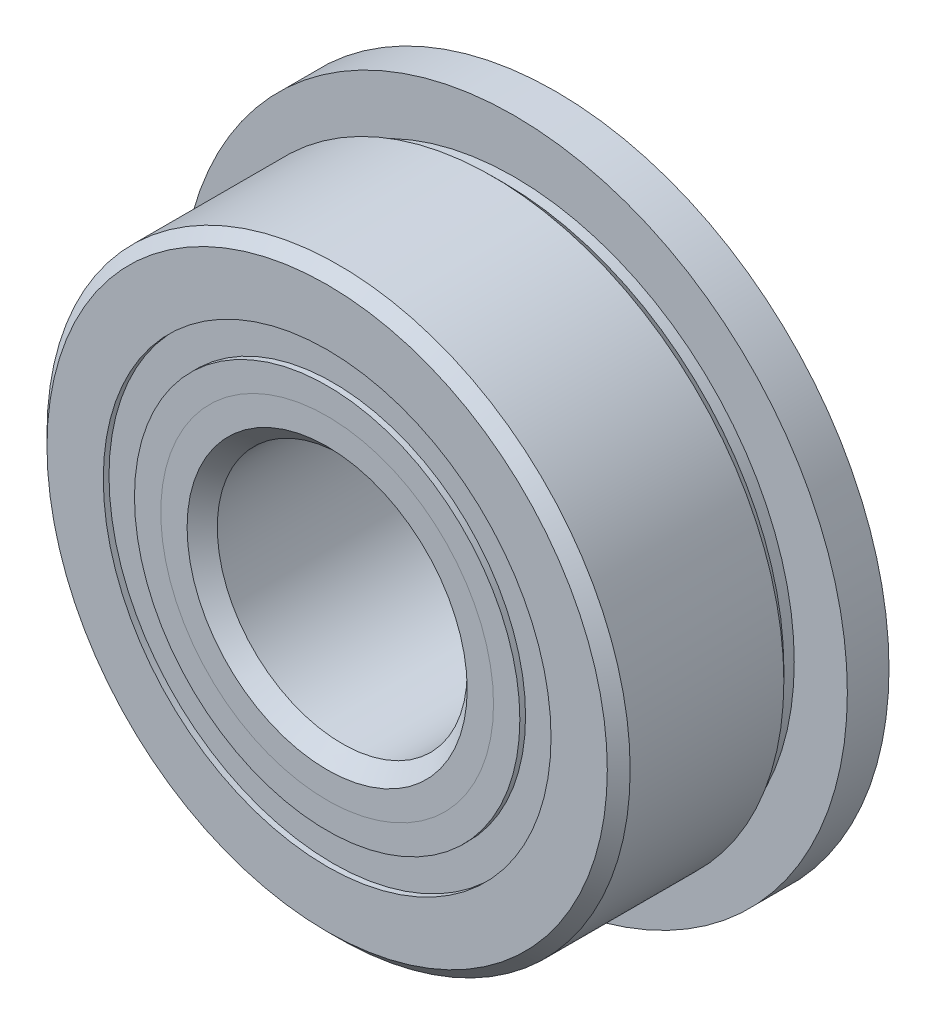
ISO-10303-21;
HEADER;
FILE_DESCRIPTION(('STEP AP214'),'2;1');
FILE_NAME('part.step','',(''),(''),'','','');
FILE_SCHEMA(('AUTOMOTIVE_DESIGN { 1 0 10303 214 1 1 1 1 }'));
ENDSEC;
DATA;
#1=APPLICATION_CONTEXT('core data for automotive mechanical design processes');
#2=APPLICATION_PROTOCOL_DEFINITION('international standard','automotive_design',2000,#1);
#3=PRODUCT_CONTEXT('',#1,'mechanical');
#4=PRODUCT('Part','Part','',(#3));
#5=PRODUCT_RELATED_PRODUCT_CATEGORY('part','',(#4));
#6=PRODUCT_DEFINITION_FORMATION('','',#4);
#7=PRODUCT_DEFINITION_CONTEXT('part definition',#1,'design');
#8=PRODUCT_DEFINITION('design','',#6,#7);
#9=PRODUCT_DEFINITION_SHAPE('','',#8);
#10=(LENGTH_UNIT() NAMED_UNIT(*) SI_UNIT(.MILLI.,.METRE.));
#11=(NAMED_UNIT(*) PLANE_ANGLE_UNIT() SI_UNIT($,.RADIAN.));
#12=(NAMED_UNIT(*) SI_UNIT($,.STERADIAN.) SOLID_ANGLE_UNIT());
#13=UNCERTAINTY_MEASURE_WITH_UNIT(LENGTH_MEASURE(1.E-05),#10,'distance_accuracy_value','');
#14=(GEOMETRIC_REPRESENTATION_CONTEXT(3) GLOBAL_UNCERTAINTY_ASSIGNED_CONTEXT((#13)) GLOBAL_UNIT_ASSIGNED_CONTEXT((#10,
#11,#12)) REPRESENTATION_CONTEXT('',''));
#15=CARTESIAN_POINT('',(0.,0.,0.));
#16=DIRECTION('',(0.,0.,1.));
#17=DIRECTION('',(1.,0.,0.));
#18=AXIS2_PLACEMENT_3D('',#15,#16,#17);
#19=CARTESIAN_POINT('',(0.,8.53146923076923,-4.138295));
#20=DIRECTION('',(0.,0.,1.));
#21=DIRECTION('',(1.,0.,0.));
#22=AXIS2_PLACEMENT_3D('',#19,#20,#21);
#23=PLANE('',#22);
#24=CARTESIAN_POINT('',(0.,0.,-4.138295));
#25=DIRECTION('',(0.,0.,1.));
#26=DIRECTION('',(1.,0.,0.));
#27=AXIS2_PLACEMENT_3D('',#24,#25,#26);
#28=CIRCLE('',#27,8.53146923076923);
#29=CARTESIAN_POINT('',(8.53146923076923,0.,-4.138295));
#30=VERTEX_POINT('',#29);
#31=EDGE_CURVE('E55',#30,#30,#28,.T.);
#32=ORIENTED_EDGE('',*,*,#31,.F.);
#33=EDGE_LOOP('',(#32));
#34=FACE_BOUND('',#33,.T.);
#35=CARTESIAN_POINT('',(0.,0.,-4.138295));
#36=DIRECTION('',(0.,0.,1.));
#37=DIRECTION('',(1.,0.,0.));
#38=AXIS2_PLACEMENT_3D('',#35,#36,#37);
#39=CIRCLE('',#38,7.34353076923077);
#40=CARTESIAN_POINT('',(7.34353076923077,0.,-4.138295));
#41=VERTEX_POINT('',#40);
#42=EDGE_CURVE('E11',#41,#41,#39,.T.);
#43=ORIENTED_EDGE('',*,*,#42,.T.);
#44=EDGE_LOOP('',(#43));
#45=FACE_BOUND('',#44,.T.);
#46=ADVANCED_FACE('F41',(#34,#45),#23,.F.);
#47=CARTESIAN_POINT('',(0.,0.,4.3561));
#48=DIRECTION('',(0.,0.,1.));
#49=DIRECTION('',(1.,0.,0.));
#50=AXIS2_PLACEMENT_3D('',#47,#48,#49);
#51=CYLINDRICAL_SURFACE('',#50,7.34353076923077);
#52=ORIENTED_EDGE('',*,*,#42,.F.);
#53=EDGE_LOOP('',(#52));
#54=FACE_BOUND('',#53,.T.);
#55=CARTESIAN_POINT('',(0.,0.,-2.02510926568538));
#56=DIRECTION('',(0.,0.,1.));
#57=DIRECTION('',(1.,0.,0.));
#58=AXIS2_PLACEMENT_3D('',#55,#56,#57);
#59=CIRCLE('',#58,7.34353076923077);
#60=CARTESIAN_POINT('',(7.34353076923077,0.,-2.02510926568538));
#61=VERTEX_POINT('',#60);
#62=EDGE_CURVE('E47',#61,#61,#59,.T.);
#63=ORIENTED_EDGE('',*,*,#62,.T.);
#64=EDGE_LOOP('',(#63));
#65=FACE_BOUND('',#64,.T.);
#66=ADVANCED_FACE('F64',(#54,#65),#51,.F.);
#67=CARTESIAN_POINT('',(0.,8.53146923076923,-2.02510926568538));
#68=DIRECTION('',(0.,0.,-1.));
#69=DIRECTION('',(-1.,0.,0.));
#70=AXIS2_PLACEMENT_3D('',#67,#68,#69);
#71=PLANE('',#70);
#72=ORIENTED_EDGE('',*,*,#62,.F.);
#73=EDGE_LOOP('',(#72));
#74=FACE_BOUND('',#73,.T.);
#75=CARTESIAN_POINT('',(0.,0.,-2.02510926568538));
#76=DIRECTION('',(0.,0.,1.));
#77=DIRECTION('',(1.,0.,0.));
#78=AXIS2_PLACEMENT_3D('',#75,#76,#77);
#79=CIRCLE('',#78,8.53146923076923);
#80=CARTESIAN_POINT('',(8.53146923076923,0.,-2.02510926568538));
#81=VERTEX_POINT('',#80);
#82=EDGE_CURVE('E51',#81,#81,#79,.T.);
#83=ORIENTED_EDGE('',*,*,#82,.T.);
#84=EDGE_LOOP('',(#83));
#85=FACE_BOUND('',#84,.T.);
#86=ADVANCED_FACE('F68',(#74,#85),#71,.F.);
#87=CARTESIAN_POINT('',(0.,0.,4.3561));
#88=DIRECTION('',(0.,0.,1.));
#89=DIRECTION('',(1.,0.,0.));
#90=AXIS2_PLACEMENT_3D('',#87,#88,#89);
#91=CYLINDRICAL_SURFACE('',#90,8.53146923076923);
#92=ORIENTED_EDGE('',*,*,#82,.F.);
#93=EDGE_LOOP('',(#92));
#94=FACE_BOUND('',#93,.T.);
#95=ORIENTED_EDGE('',*,*,#31,.T.);
#96=EDGE_LOOP('',(#95));
#97=FACE_BOUND('',#96,.T.);
#98=ADVANCED_FACE('F61',(#94,#97),#91,.T.);
#99=CLOSED_SHELL('',(#46,#66,#86,#98));
#100=MANIFOLD_SOLID_BREP('B2',#99);
#101=CARTESIAN_POINT('',(0.,8.53146923076923,4.138295));
#102=DIRECTION('',(0.,0.,-1.));
#103=DIRECTION('',(-1.,0.,0.));
#104=AXIS2_PLACEMENT_3D('',#101,#102,#103);
#105=PLANE('',#104);
#106=CARTESIAN_POINT('',(0.,0.,4.138295));
#107=DIRECTION('',(0.,0.,1.));
#108=DIRECTION('',(1.,0.,0.));
#109=AXIS2_PLACEMENT_3D('',#106,#107,#108);
#110=CIRCLE('',#109,7.34353076923077);
#111=CARTESIAN_POINT('',(7.34353076923077,0.,4.138295));
#112=VERTEX_POINT('',#111);
#113=EDGE_CURVE('E40',#112,#112,#110,.T.);
#114=ORIENTED_EDGE('',*,*,#113,.F.);
#115=EDGE_LOOP('',(#114));
#116=FACE_BOUND('',#115,.T.);
#117=CARTESIAN_POINT('',(0.,0.,4.138295));
#118=DIRECTION('',(0.,0.,1.));
#119=DIRECTION('',(1.,0.,0.));
#120=AXIS2_PLACEMENT_3D('',#117,#118,#119);
#121=CIRCLE('',#120,8.53146923076923);
#122=CARTESIAN_POINT('',(8.53146923076923,0.,4.138295));
#123=VERTEX_POINT('',#122);
#124=EDGE_CURVE('E122',#123,#123,#121,.T.);
#125=ORIENTED_EDGE('',*,*,#124,.T.);
#126=EDGE_LOOP('',(#125));
#127=FACE_BOUND('',#126,.T.);
#128=ADVANCED_FACE('F108',(#116,#127),#105,.F.);
#129=CARTESIAN_POINT('',(0.,0.,4.3561));
#130=DIRECTION('',(0.,0.,1.));
#131=DIRECTION('',(1.,0.,0.));
#132=AXIS2_PLACEMENT_3D('',#129,#130,#131);
#133=CYLINDRICAL_SURFACE('',#132,7.34353076923077);
#134=CARTESIAN_POINT('',(0.,0.,2.02510926568538));
#135=DIRECTION('',(0.,0.,1.));
#136=DIRECTION('',(1.,0.,0.));
#137=AXIS2_PLACEMENT_3D('',#134,#135,#136);
#138=CIRCLE('',#137,7.34353076923077);
#139=CARTESIAN_POINT('',(7.34353076923077,0.,2.02510926568538));
#140=VERTEX_POINT('',#139);
#141=EDGE_CURVE('E114',#140,#140,#138,.T.);
#142=ORIENTED_EDGE('',*,*,#141,.F.);
#143=EDGE_LOOP('',(#142));
#144=FACE_BOUND('',#143,.T.);
#145=ORIENTED_EDGE('',*,*,#113,.T.);
#146=EDGE_LOOP('',(#145));
#147=FACE_BOUND('',#146,.T.);
#148=ADVANCED_FACE('F137',(#144,#147),#133,.F.);
#149=CARTESIAN_POINT('',(0.,8.53146923076923,2.02510926568538));
#150=DIRECTION('',(0.,0.,1.));
#151=DIRECTION('',(1.,0.,0.));
#152=AXIS2_PLACEMENT_3D('',#149,#150,#151);
#153=PLANE('',#152);
#154=CARTESIAN_POINT('',(0.,0.,2.02510926568538));
#155=DIRECTION('',(0.,0.,1.));
#156=DIRECTION('',(1.,0.,0.));
#157=AXIS2_PLACEMENT_3D('',#154,#155,#156);
#158=CIRCLE('',#157,8.53146923076923);
#159=CARTESIAN_POINT('',(8.53146923076923,0.,2.02510926568538));
#160=VERTEX_POINT('',#159);
#161=EDGE_CURVE('E118',#160,#160,#158,.T.);
#162=ORIENTED_EDGE('',*,*,#161,.F.);
#163=EDGE_LOOP('',(#162));
#164=FACE_BOUND('',#163,.T.);
#165=ORIENTED_EDGE('',*,*,#141,.T.);
#166=EDGE_LOOP('',(#165));
#167=FACE_BOUND('',#166,.T.);
#168=ADVANCED_FACE('F132',(#164,#167),#153,.F.);
#169=CARTESIAN_POINT('',(0.,0.,4.3561));
#170=DIRECTION('',(0.,0.,1.));
#171=DIRECTION('',(1.,0.,0.));
#172=AXIS2_PLACEMENT_3D('',#169,#170,#171);
#173=CYLINDRICAL_SURFACE('',#172,8.53146923076923);
#174=ORIENTED_EDGE('',*,*,#124,.F.);
#175=EDGE_LOOP('',(#174));
#176=FACE_BOUND('',#175,.T.);
#177=ORIENTED_EDGE('',*,*,#161,.T.);
#178=EDGE_LOOP('',(#177));
#179=FACE_BOUND('',#178,.T.);
#180=ADVANCED_FACE('F129',(#176,#179),#173,.T.);
#181=CLOSED_SHELL('',(#128,#148,#168,#180));
#182=MANIFOLD_SOLID_BREP('B6',#181);
#183=CARTESIAN_POINT('',(-3.96874999999991,6.87407664253903,0.));
#184=DIRECTION('',(0.,0.,1.));
#185=DIRECTION('',(0.499999999999989,-0.866025403784445,0.));
#186=AXIS2_PLACEMENT_3D('',#183,#184,#185);
#187=SPHERICAL_SURFACE('',#186,2.02510926568538);
#188=CARTESIAN_POINT('',(-3.96874999999991,6.87407664253903,2.02510926568538));
#189=VERTEX_POINT('',#188);
#190=VERTEX_LOOP('',#189);
#191=FACE_BOUND('',#190,.T.);
#192=ADVANCED_FACE('F175',(#191),#187,.T.);
#193=CLOSED_SHELL('',(#192));
#194=MANIFOLD_SOLID_BREP('B35',#193);
#195=CARTESIAN_POINT('',(-6.87407664253893,3.96875000000008,0.));
#196=DIRECTION('',(0.,0.,1.));
#197=DIRECTION('',(0.866025403784433,-0.50000000000001,0.));
#198=AXIS2_PLACEMENT_3D('',#195,#196,#197);
#199=SPHERICAL_SURFACE('',#198,2.02510926568538);
#200=CARTESIAN_POINT('',(-6.87407664253893,3.96875000000008,2.02510926568538));
#201=VERTEX_POINT('',#200);
#202=VERTEX_LOOP('',#201);
#203=FACE_BOUND('',#202,.T.);
#204=ADVANCED_FACE('F206',(#203),#199,.T.);
#205=CLOSED_SHELL('',(#204));
#206=MANIFOLD_SOLID_BREP('B104',#205);
#207=CARTESIAN_POINT('',(-7.9375,0.,0.));
#208=DIRECTION('',(0.,0.,1.));
#209=DIRECTION('',(1.,0.,0.));
#210=AXIS2_PLACEMENT_3D('',#207,#208,#209);
#211=SPHERICAL_SURFACE('',#210,2.02510926568538);
#212=CARTESIAN_POINT('',(-7.9375,0.,2.02510926568538));
#213=VERTEX_POINT('',#212);
#214=VERTEX_LOOP('',#213);
#215=FACE_BOUND('',#214,.T.);
#216=ADVANCED_FACE('F237',(#215),#211,.T.);
#217=CLOSED_SHELL('',(#216));
#218=MANIFOLD_SOLID_BREP('B171',#217);
#219=CARTESIAN_POINT('',(-6.87407664253902,-3.96874999999994,0.));
#220=DIRECTION('',(0.,0.,1.));
#221=DIRECTION('',(0.866025403784443,0.499999999999992,0.));
#222=AXIS2_PLACEMENT_3D('',#219,#220,#221);
#223=SPHERICAL_SURFACE('',#222,2.02510926568538);
#224=CARTESIAN_POINT('',(-6.87407664253902,-3.96874999999994,2.02510926568538));
#225=VERTEX_POINT('',#224);
#226=VERTEX_LOOP('',#225);
#227=FACE_BOUND('',#226,.T.);
#228=ADVANCED_FACE('F268',(#227),#223,.T.);
#229=CLOSED_SHELL('',(#228));
#230=MANIFOLD_SOLID_BREP('B202',#229);
#231=CARTESIAN_POINT('',(-3.96875000000006,-6.87407664253895,0.));
#232=DIRECTION('',(0.,0.,1.));
#233=DIRECTION('',(0.500000000000007,0.866025403784435,0.));
#234=AXIS2_PLACEMENT_3D('',#231,#232,#233);
#235=SPHERICAL_SURFACE('',#234,2.02510926568538);
#236=CARTESIAN_POINT('',(-3.96875000000006,-6.87407664253895,2.02510926568538));
#237=VERTEX_POINT('',#236);
#238=VERTEX_LOOP('',#237);
#239=FACE_BOUND('',#238,.T.);
#240=ADVANCED_FACE('F299',(#239),#235,.T.);
#241=CLOSED_SHELL('',(#240));
#242=MANIFOLD_SOLID_BREP('B233',#241);
#243=CARTESIAN_POINT('',(0.,-7.9375,0.));
#244=DIRECTION('',(0.,0.,1.));
#245=DIRECTION('',(0.,1.,0.));
#246=AXIS2_PLACEMENT_3D('',#243,#244,#245);
#247=SPHERICAL_SURFACE('',#246,2.02510926568538);
#248=CARTESIAN_POINT('',(0.,-7.9375,2.02510926568538));
#249=VERTEX_POINT('',#248);
#250=VERTEX_LOOP('',#249);
#251=FACE_BOUND('',#250,.T.);
#252=ADVANCED_FACE('F330',(#251),#247,.T.);
#253=CLOSED_SHELL('',(#252));
#254=MANIFOLD_SOLID_BREP('B264',#253);
#255=CARTESIAN_POINT('',(3.96874999999996,-6.874076642539,0.));
#256=DIRECTION('',(0.,0.,1.));
#257=DIRECTION('',(-0.499999999999995,0.866025403784442,0.));
#258=AXIS2_PLACEMENT_3D('',#255,#256,#257);
#259=SPHERICAL_SURFACE('',#258,2.02510926568538);
#260=CARTESIAN_POINT('',(3.96874999999996,-6.874076642539,2.02510926568538));
#261=VERTEX_POINT('',#260);
#262=VERTEX_LOOP('',#261);
#263=FACE_BOUND('',#262,.T.);
#264=ADVANCED_FACE('F361',(#263),#259,.T.);
#265=CLOSED_SHELL('',(#264));
#266=MANIFOLD_SOLID_BREP('B295',#265);
#267=CARTESIAN_POINT('',(6.87407664253896,-3.96875000000003,0.));
#268=DIRECTION('',(0.,0.,1.));
#269=DIRECTION('',(-0.866025403784436,0.500000000000004,0.));
#270=AXIS2_PLACEMENT_3D('',#267,#268,#269);
#271=SPHERICAL_SURFACE('',#270,2.02510926568538);
#272=CARTESIAN_POINT('',(6.87407664253896,-3.96875000000003,2.02510926568538));
#273=VERTEX_POINT('',#272);
#274=VERTEX_LOOP('',#273);
#275=FACE_BOUND('',#274,.T.);
#276=ADVANCED_FACE('F392',(#275),#271,.T.);
#277=CLOSED_SHELL('',(#276));
#278=MANIFOLD_SOLID_BREP('B326',#277);
#279=CARTESIAN_POINT('',(7.9375,0.,0.));
#280=DIRECTION('',(0.,0.,1.));
#281=DIRECTION('',(-1.,0.,0.));
#282=AXIS2_PLACEMENT_3D('',#279,#280,#281);
#283=SPHERICAL_SURFACE('',#282,2.02510926568538);
#284=CARTESIAN_POINT('',(7.9375,0.,2.02510926568538));
#285=VERTEX_POINT('',#284);
#286=VERTEX_LOOP('',#285);
#287=FACE_BOUND('',#286,.T.);
#288=ADVANCED_FACE('F423',(#287),#283,.T.);
#289=CLOSED_SHELL('',(#288));
#290=MANIFOLD_SOLID_BREP('B357',#289);
#291=CARTESIAN_POINT('',(6.87407664253899,3.96874999999998,0.));
#292=DIRECTION('',(0.,0.,1.));
#293=DIRECTION('',(-0.86602540378444,-0.499999999999998,0.));
#294=AXIS2_PLACEMENT_3D('',#291,#292,#293);
#295=SPHERICAL_SURFACE('',#294,2.02510926568538);
#296=CARTESIAN_POINT('',(6.87407664253899,3.96874999999998,2.02510926568538));
#297=VERTEX_POINT('',#296);
#298=VERTEX_LOOP('',#297);
#299=FACE_BOUND('',#298,.T.);
#300=ADVANCED_FACE('F454',(#299),#295,.T.);
#301=CLOSED_SHELL('',(#300));
#302=MANIFOLD_SOLID_BREP('B388',#301);
#303=CARTESIAN_POINT('',(3.96875000000001,6.87407664253898,0.));
#304=DIRECTION('',(0.,0.,1.));
#305=DIRECTION('',(-0.500000000000001,-0.866025403784438,0.));
#306=AXIS2_PLACEMENT_3D('',#303,#304,#305);
#307=SPHERICAL_SURFACE('',#306,2.02510926568538);
#308=CARTESIAN_POINT('',(3.96875000000001,6.87407664253898,2.02510926568538));
#309=VERTEX_POINT('',#308);
#310=VERTEX_LOOP('',#309);
#311=FACE_BOUND('',#310,.T.);
#312=ADVANCED_FACE('F485',(#311),#307,.T.);
#313=CLOSED_SHELL('',(#312));
#314=MANIFOLD_SOLID_BREP('B419',#313);
#315=CARTESIAN_POINT('',(0.,7.9375,0.));
#316=DIRECTION('',(0.,0.,1.));
#317=DIRECTION('',(0.,-1.,0.));
#318=AXIS2_PLACEMENT_3D('',#315,#316,#317);
#319=SPHERICAL_SURFACE('',#318,2.02510926568538);
#320=CARTESIAN_POINT('',(0.,7.9375,2.02510926568538));
#321=VERTEX_POINT('',#320);
#322=VERTEX_LOOP('',#321);
#323=FACE_BOUND('',#322,.T.);
#324=ADVANCED_FACE('F518',(#323),#319,.T.);
#325=CLOSED_SHELL('',(#324));
#326=MANIFOLD_SOLID_BREP('B450',#325);
#327=CARTESIAN_POINT('',(0.,6.34048806819404,4.3561));
#328=DIRECTION('',(0.,0.,-1.));
#329=DIRECTION('',(-1.,0.,0.));
#330=AXIS2_PLACEMENT_3D('',#327,#328,#329);
#331=PLANE('',#330);
#332=CARTESIAN_POINT('',(0.,0.,4.3561));
#333=DIRECTION('',(0.,0.,1.));
#334=DIRECTION('',(1.,0.,0.));
#335=AXIS2_PLACEMENT_3D('',#332,#333,#334);
#336=CIRCLE('',#335,5.33744536715731);
#337=CARTESIAN_POINT('',(5.33744536715731,0.,4.3561));
#338=VERTEX_POINT('',#337);
#339=EDGE_CURVE('E572',#338,#338,#336,.T.);
#340=ORIENTED_EDGE('',*,*,#339,.F.);
#341=EDGE_LOOP('',(#340));
#342=FACE_BOUND('',#341,.T.);
#343=CARTESIAN_POINT('',(0.,0.,4.3561));
#344=DIRECTION('',(0.,0.,1.));
#345=DIRECTION('',(1.,0.,0.));
#346=AXIS2_PLACEMENT_3D('',#343,#344,#345);
#347=CIRCLE('',#346,6.34048806819404);
#348=CARTESIAN_POINT('',(6.34048806819404,0.,4.3561));
#349=VERTEX_POINT('',#348);
#350=EDGE_CURVE('E517',#349,#349,#347,.T.);
#351=ORIENTED_EDGE('',*,*,#350,.T.);
#352=EDGE_LOOP('',(#351));
#353=FACE_BOUND('',#352,.T.);
#354=ADVANCED_FACE('F538',(#342,#353),#331,.F.);
#355=CARTESIAN_POINT('',(0.,0.,3.35305729896327));
#356=DIRECTION('',(0.,0.,1.));
#357=DIRECTION('',(1.,0.,0.));
#358=AXIS2_PLACEMENT_3D('',#355,#356,#357);
#359=CONICAL_SURFACE('',#358,5.33744536715731,0.78539816339745);
#360=ORIENTED_EDGE('',*,*,#350,.F.);
#361=EDGE_LOOP('',(#360));
#362=FACE_BOUND('',#361,.T.);
#363=CARTESIAN_POINT('',(0.,0.,3.35305729896327));
#364=DIRECTION('',(0.,0.,1.));
#365=DIRECTION('',(1.,0.,0.));
#366=AXIS2_PLACEMENT_3D('',#363,#364,#365);
#367=CIRCLE('',#366,5.33744536715731);
#368=CARTESIAN_POINT('',(5.33744536715731,0.,3.35305729896327));
#369=VERTEX_POINT('',#368);
#370=EDGE_CURVE('E544',#369,#369,#367,.T.);
#371=ORIENTED_EDGE('',*,*,#370,.T.);
#372=EDGE_LOOP('',(#371));
#373=FACE_BOUND('',#372,.T.);
#374=ADVANCED_FACE('F579',(#362,#373),#359,.T.);
#375=CARTESIAN_POINT('',(0.,0.,4.3561));
#376=DIRECTION('',(0.,0.,1.));
#377=DIRECTION('',(1.,0.,0.));
#378=AXIS2_PLACEMENT_3D('',#375,#376,#377);
#379=CYLINDRICAL_SURFACE('',#378,5.33744536715731);
#380=ORIENTED_EDGE('',*,*,#370,.F.);
#381=EDGE_LOOP('',(#380));
#382=FACE_BOUND('',#381,.T.);
#383=CARTESIAN_POINT('',(0.,0.,0.));
#384=DIRECTION('',(0.,0.,1.));
#385=DIRECTION('',(1.,0.,0.));
#386=AXIS2_PLACEMENT_3D('',#383,#384,#385);
#387=CIRCLE('',#386,5.33744536715731);
#388=CARTESIAN_POINT('',(5.33744536715731,0.,0.));
#389=VERTEX_POINT('',#388);
#390=EDGE_CURVE('E548',#389,#389,#387,.T.);
#391=ORIENTED_EDGE('',*,*,#390,.T.);
#392=EDGE_LOOP('',(#391));
#393=FACE_BOUND('',#392,.T.);
#394=ADVANCED_FACE('F583',(#382,#393),#379,.T.);
#395=CARTESIAN_POINT('',(0.,5.33744536715731,0.));
#396=DIRECTION('',(0.,0.,-1.));
#397=DIRECTION('',(-1.,0.,0.));
#398=AXIS2_PLACEMENT_3D('',#395,#396,#397);
#399=PLANE('',#398);
#400=ORIENTED_EDGE('',*,*,#390,.F.);
#401=EDGE_LOOP('',(#400));
#402=FACE_BOUND('',#401,.T.);
#403=CARTESIAN_POINT('',(0.,0.,0.));
#404=DIRECTION('',(0.,0.,1.));
#405=DIRECTION('',(1.,0.,0.));
#406=AXIS2_PLACEMENT_3D('',#403,#404,#405);
#407=CIRCLE('',#406,5.91239073431462);
#408=CARTESIAN_POINT('',(5.91239073431462,0.,0.));
#409=VERTEX_POINT('',#408);
#410=EDGE_CURVE('E552',#409,#409,#407,.T.);
#411=ORIENTED_EDGE('',*,*,#410,.T.);
#412=EDGE_LOOP('',(#411));
#413=FACE_BOUND('',#412,.T.);
#414=ADVANCED_FACE('F588',(#402,#413),#399,.F.);
#415=CARTESIAN_POINT('',(0.,0.,0.));
#416=DIRECTION('',(0.,0.,1.));
#417=DIRECTION('',(1.,0.,0.));
#418=AXIS2_PLACEMENT_3D('',#415,#416,#417);
#419=TOROIDAL_SURFACE('',#418,7.9375,2.02510926568538);
#420=ORIENTED_EDGE('',*,*,#410,.F.);
#421=EDGE_LOOP('',(#420));
#422=FACE_BOUND('',#421,.T.);
#423=CARTESIAN_POINT('',(0.,0.,-1.93604444444445));
#424=DIRECTION('',(0.,0.,1.));
#425=DIRECTION('',(1.,0.,0.));
#426=AXIS2_PLACEMENT_3D('',#423,#424,#425);
#427=CIRCLE('',#426,7.34353076923077);
#428=CARTESIAN_POINT('',(7.34353076923077,0.,-1.93604444444445));
#429=VERTEX_POINT('',#428);
#430=EDGE_CURVE('E557',#429,#429,#427,.T.);
#431=ORIENTED_EDGE('',*,*,#430,.T.);
#432=EDGE_LOOP('',(#431));
#433=FACE_BOUND('',#432,.T.);
#434=ADVANCED_FACE('F594',(#422,#433),#419,.F.);
#435=CARTESIAN_POINT('',(0.,0.,4.3561));
#436=DIRECTION('',(0.,0.,1.));
#437=DIRECTION('',(1.,0.,0.));
#438=AXIS2_PLACEMENT_3D('',#435,#436,#437);
#439=CYLINDRICAL_SURFACE('',#438,7.34353076923077);
#440=ORIENTED_EDGE('',*,*,#430,.F.);
#441=EDGE_LOOP('',(#440));
#442=FACE_BOUND('',#441,.T.);
#443=CARTESIAN_POINT('',(0.,0.,-5.96265));
#444=DIRECTION('',(0.,0.,1.));
#445=DIRECTION('',(1.,0.,0.));
#446=AXIS2_PLACEMENT_3D('',#443,#444,#445);
#447=CIRCLE('',#446,7.34353076923077);
#448=CARTESIAN_POINT('',(7.34353076923077,0.,-5.96265));
#449=VERTEX_POINT('',#448);
#450=EDGE_CURVE('E560',#449,#449,#447,.T.);
#451=ORIENTED_EDGE('',*,*,#450,.T.);
#452=EDGE_LOOP('',(#451));
#453=FACE_BOUND('',#452,.T.);
#454=ADVANCED_FACE('F598',(#442,#453),#439,.T.);
#455=CARTESIAN_POINT('',(0.,5.19811,-5.96265));
#456=DIRECTION('',(0.,0.,1.));
#457=DIRECTION('',(1.,0.,0.));
#458=AXIS2_PLACEMENT_3D('',#455,#456,#457);
#459=PLANE('',#458);
#460=ORIENTED_EDGE('',*,*,#450,.F.);
#461=EDGE_LOOP('',(#460));
#462=FACE_BOUND('',#461,.T.);
#463=CARTESIAN_POINT('',(0.,0.,-5.96265));
#464=DIRECTION('',(0.,0.,1.));
#465=DIRECTION('',(1.,0.,0.));
#466=AXIS2_PLACEMENT_3D('',#463,#464,#465);
#467=CIRCLE('',#466,5.19811);
#468=CARTESIAN_POINT('',(5.19811,0.,-5.96265));
#469=VERTEX_POINT('',#468);
#470=EDGE_CURVE('E563',#469,#469,#467,.T.);
#471=ORIENTED_EDGE('',*,*,#470,.T.);
#472=EDGE_LOOP('',(#471));
#473=FACE_BOUND('',#472,.T.);
#474=ADVANCED_FACE('F602',(#462,#473),#459,.F.);
#475=CARTESIAN_POINT('',(0.,0.,-5.52704));
#476=DIRECTION('',(0.,0.,-1.));
#477=DIRECTION('',(-1.,0.,0.));
#478=AXIS2_PLACEMENT_3D('',#475,#476,#477);
#479=CONICAL_SURFACE('',#478,4.7625,0.785398163397446);
#480=ORIENTED_EDGE('',*,*,#470,.F.);
#481=EDGE_LOOP('',(#480));
#482=FACE_BOUND('',#481,.T.);
#483=CARTESIAN_POINT('',(0.,0.,-5.52704));
#484=DIRECTION('',(0.,0.,1.));
#485=DIRECTION('',(1.,0.,0.));
#486=AXIS2_PLACEMENT_3D('',#483,#484,#485);
#487=CIRCLE('',#486,4.7625);
#488=CARTESIAN_POINT('',(4.7625,0.,-5.52704));
#489=VERTEX_POINT('',#488);
#490=EDGE_CURVE('E566',#489,#489,#487,.T.);
#491=ORIENTED_EDGE('',*,*,#490,.T.);
#492=EDGE_LOOP('',(#491));
#493=FACE_BOUND('',#492,.T.);
#494=ADVANCED_FACE('F606',(#482,#493),#479,.F.);
#495=CARTESIAN_POINT('',(0.,0.,4.3561));
#496=DIRECTION('',(0.,0.,1.));
#497=DIRECTION('',(1.,0.,0.));
#498=AXIS2_PLACEMENT_3D('',#495,#496,#497);
#499=CYLINDRICAL_SURFACE('',#498,4.7625);
#500=ORIENTED_EDGE('',*,*,#490,.F.);
#501=EDGE_LOOP('',(#500));
#502=FACE_BOUND('',#501,.T.);
#503=CARTESIAN_POINT('',(0.,0.,3.78115463284269));
#504=DIRECTION('',(0.,0.,1.));
#505=DIRECTION('',(1.,0.,0.));
#506=AXIS2_PLACEMENT_3D('',#503,#504,#505);
#507=CIRCLE('',#506,4.7625);
#508=CARTESIAN_POINT('',(4.7625,0.,3.78115463284269));
#509=VERTEX_POINT('',#508);
#510=EDGE_CURVE('E569',#509,#509,#507,.T.);
#511=ORIENTED_EDGE('',*,*,#510,.T.);
#512=EDGE_LOOP('',(#511));
#513=FACE_BOUND('',#512,.T.);
#514=ADVANCED_FACE('F610',(#502,#513),#499,.F.);
#515=CARTESIAN_POINT('',(0.,0.,4.3561));
#516=DIRECTION('',(0.,0.,1.));
#517=DIRECTION('',(1.,0.,0.));
#518=AXIS2_PLACEMENT_3D('',#515,#516,#517);
#519=CONICAL_SURFACE('',#518,5.33744536715731,0.785398163397448);
#520=ORIENTED_EDGE('',*,*,#510,.F.);
#521=EDGE_LOOP('',(#520));
#522=FACE_BOUND('',#521,.T.);
#523=ORIENTED_EDGE('',*,*,#339,.T.);
#524=EDGE_LOOP('',(#523));
#525=FACE_BOUND('',#524,.T.);
#526=ADVANCED_FACE('F576',(#522,#525),#519,.F.);
#527=CLOSED_SHELL('',(#354,#374,#394,#414,#434,#454,#474,#494,#514,#526));
#528=MANIFOLD_SOLID_BREP('B481',#527);
#529=CARTESIAN_POINT('',(0.,7.34353076923077,4.3561));
#530=DIRECTION('',(0.,0.,-1.));
#531=DIRECTION('',(-1.,0.,0.));
#532=AXIS2_PLACEMENT_3D('',#529,#530,#531);
#533=PLANE('',#532);
#534=CARTESIAN_POINT('',(0.,0.,4.3561));
#535=DIRECTION('',(0.,0.,1.));
#536=DIRECTION('',(1.,0.,0.));
#537=AXIS2_PLACEMENT_3D('',#534,#535,#536);
#538=CIRCLE('',#537,6.34048806819404);
#539=CARTESIAN_POINT('',(6.34048806819404,0.,4.3561));
#540=VERTEX_POINT('',#539);
#541=EDGE_CURVE('E537',#540,#540,#538,.T.);
#542=ORIENTED_EDGE('',*,*,#541,.F.);
#543=EDGE_LOOP('',(#542));
#544=FACE_BOUND('',#543,.T.);
#545=CARTESIAN_POINT('',(0.,0.,4.3561));
#546=DIRECTION('',(0.,0.,1.));
#547=DIRECTION('',(1.,0.,0.));
#548=AXIS2_PLACEMENT_3D('',#545,#546,#547);
#549=CIRCLE('',#548,7.34353076923077);
#550=CARTESIAN_POINT('',(7.34353076923077,0.,4.3561));
#551=VERTEX_POINT('',#550);
#552=EDGE_CURVE('E718',#551,#551,#549,.T.);
#553=ORIENTED_EDGE('',*,*,#552,.T.);
#554=EDGE_LOOP('',(#553));
#555=FACE_BOUND('',#554,.T.);
#556=ADVANCED_FACE('F696',(#544,#555),#533,.F.);
#557=CARTESIAN_POINT('',(0.,0.,4.3561));
#558=DIRECTION('',(0.,0.,1.));
#559=DIRECTION('',(1.,0.,0.));
#560=AXIS2_PLACEMENT_3D('',#557,#558,#559);
#561=CONICAL_SURFACE('',#560,6.34048806819404,0.78539816339745);
#562=CARTESIAN_POINT('',(0.,0.,3.35305729896327));
#563=DIRECTION('',(0.,0.,1.));
#564=DIRECTION('',(1.,0.,0.));
#565=AXIS2_PLACEMENT_3D('',#562,#563,#564);
#566=CIRCLE('',#565,5.33744536715731);
#567=CARTESIAN_POINT('',(5.33744536715731,0.,3.35305729896327));
#568=VERTEX_POINT('',#567);
#569=EDGE_CURVE('E702',#568,#568,#566,.T.);
#570=ORIENTED_EDGE('',*,*,#569,.F.);
#571=EDGE_LOOP('',(#570));
#572=FACE_BOUND('',#571,.T.);
#573=ORIENTED_EDGE('',*,*,#541,.T.);
#574=EDGE_LOOP('',(#573));
#575=FACE_BOUND('',#574,.T.);
#576=ADVANCED_FACE('F743',(#572,#575),#561,.F.);
#577=CARTESIAN_POINT('',(0.,0.,4.3561));
#578=DIRECTION('',(0.,0.,1.));
#579=DIRECTION('',(1.,0.,0.));
#580=AXIS2_PLACEMENT_3D('',#577,#578,#579);
#581=CYLINDRICAL_SURFACE('',#580,5.33744536715731);
#582=CARTESIAN_POINT('',(0.,0.,0.));
#583=DIRECTION('',(0.,0.,1.));
#584=DIRECTION('',(1.,0.,0.));
#585=AXIS2_PLACEMENT_3D('',#582,#583,#584);
#586=CIRCLE('',#585,5.33744536715731);
#587=CARTESIAN_POINT('',(5.33744536715731,0.,0.));
#588=VERTEX_POINT('',#587);
#589=EDGE_CURVE('E706',#588,#588,#586,.T.);
#590=ORIENTED_EDGE('',*,*,#589,.F.);
#591=EDGE_LOOP('',(#590));
#592=FACE_BOUND('',#591,.T.);
#593=ORIENTED_EDGE('',*,*,#569,.T.);
#594=EDGE_LOOP('',(#593));
#595=FACE_BOUND('',#594,.T.);
#596=ADVANCED_FACE('F738',(#592,#595),#581,.F.);
#597=CARTESIAN_POINT('',(0.,5.33744536715731,0.));
#598=DIRECTION('',(0.,0.,1.));
#599=DIRECTION('',(1.,0.,0.));
#600=AXIS2_PLACEMENT_3D('',#597,#598,#599);
#601=PLANE('',#600);
#602=CARTESIAN_POINT('',(0.,0.,0.));
#603=DIRECTION('',(0.,0.,1.));
#604=DIRECTION('',(1.,0.,0.));
#605=AXIS2_PLACEMENT_3D('',#602,#603,#604);
#606=CIRCLE('',#605,5.91239073431462);
#607=CARTESIAN_POINT('',(5.91239073431462,0.,0.));
#608=VERTEX_POINT('',#607);
#609=EDGE_CURVE('E710',#608,#608,#606,.T.);
#610=ORIENTED_EDGE('',*,*,#609,.F.);
#611=EDGE_LOOP('',(#610));
#612=FACE_BOUND('',#611,.T.);
#613=ORIENTED_EDGE('',*,*,#589,.T.);
#614=EDGE_LOOP('',(#613));
#615=FACE_BOUND('',#614,.T.);
#616=ADVANCED_FACE('F732',(#612,#615),#601,.F.);
#617=CARTESIAN_POINT('',(0.,0.,0.));
#618=DIRECTION('',(0.,0.,1.));
#619=DIRECTION('',(1.,0.,0.));
#620=AXIS2_PLACEMENT_3D('',#617,#618,#619);
#621=TOROIDAL_SURFACE('',#620,7.9375,2.02510926568538);
#622=CARTESIAN_POINT('',(0.,0.,1.93604444444444));
#623=DIRECTION('',(0.,0.,1.));
#624=DIRECTION('',(1.,0.,0.));
#625=AXIS2_PLACEMENT_3D('',#622,#623,#624);
#626=CIRCLE('',#625,7.34353076923077);
#627=CARTESIAN_POINT('',(7.34353076923077,0.,1.93604444444444));
#628=VERTEX_POINT('',#627);
#629=EDGE_CURVE('E715',#628,#628,#626,.T.);
#630=ORIENTED_EDGE('',*,*,#629,.F.);
#631=EDGE_LOOP('',(#630));
#632=FACE_BOUND('',#631,.T.);
#633=ORIENTED_EDGE('',*,*,#609,.T.);
#634=EDGE_LOOP('',(#633));
#635=FACE_BOUND('',#634,.T.);
#636=ADVANCED_FACE('F726',(#632,#635),#621,.F.);
#637=CARTESIAN_POINT('',(0.,0.,4.3561));
#638=DIRECTION('',(0.,0.,1.));
#639=DIRECTION('',(1.,0.,0.));
#640=AXIS2_PLACEMENT_3D('',#637,#638,#639);
#641=CYLINDRICAL_SURFACE('',#640,7.34353076923077);
#642=ORIENTED_EDGE('',*,*,#552,.F.);
#643=EDGE_LOOP('',(#642));
#644=FACE_BOUND('',#643,.T.);
#645=ORIENTED_EDGE('',*,*,#629,.T.);
#646=EDGE_LOOP('',(#645));
#647=FACE_BOUND('',#646,.T.);
#648=ADVANCED_FACE('F723',(#644,#647),#641,.T.);
#649=CLOSED_SHELL('',(#556,#576,#596,#616,#636,#648));
#650=MANIFOLD_SOLID_BREP('B512',#649);
#651=CARTESIAN_POINT('',(0.,0.,4.3561));
#652=DIRECTION('',(0.,0.,1.));
#653=DIRECTION('',(1.,0.,0.));
#654=AXIS2_PLACEMENT_3D('',#651,#652,#653);
#655=CYLINDRICAL_SURFACE('',#654,11.1125);
#656=CARTESIAN_POINT('',(0.,0.,3.92049));
#657=DIRECTION('',(0.,0.,1.));
#658=DIRECTION('',(1.,0.,0.));
#659=AXIS2_PLACEMENT_3D('',#656,#657,#658);
#660=CIRCLE('',#659,11.1125);
#661=CARTESIAN_POINT('',(11.1125,0.,3.92049));
#662=VERTEX_POINT('',#661);
#663=EDGE_CURVE('E695',#662,#662,#660,.T.);
#664=ORIENTED_EDGE('',*,*,#663,.F.);
#665=EDGE_LOOP('',(#664));
#666=FACE_BOUND('',#665,.T.);
#667=CARTESIAN_POINT('',(0.,0.,-1.936115));
#668=DIRECTION('',(0.,0.,1.));
#669=DIRECTION('',(1.,0.,0.));
#670=AXIS2_PLACEMENT_3D('',#667,#668,#669);
#671=CIRCLE('',#670,11.1125);
#672=CARTESIAN_POINT('',(11.1125,0.,-1.936115));
#673=VERTEX_POINT('',#672);
#674=EDGE_CURVE('E825',#673,#673,#671,.T.);
#675=ORIENTED_EDGE('',*,*,#674,.T.);
#676=EDGE_LOOP('',(#675));
#677=FACE_BOUND('',#676,.T.);
#678=ADVANCED_FACE('F787',(#666,#677),#655,.T.);
#679=CARTESIAN_POINT('',(0.,0.,3.92049));
#680=DIRECTION('',(0.,0.,-1.));
#681=DIRECTION('',(-1.,0.,0.));
#682=AXIS2_PLACEMENT_3D('',#679,#680,#681);
#683=CONICAL_SURFACE('',#682,11.1125,0.785398163397447);
#684=CARTESIAN_POINT('',(0.,0.,4.3561));
#685=DIRECTION('',(0.,0.,1.));
#686=DIRECTION('',(1.,0.,0.));
#687=AXIS2_PLACEMENT_3D('',#684,#685,#686);
#688=CIRCLE('',#687,10.67689);
#689=CARTESIAN_POINT('',(10.67689,0.,4.3561));
#690=VERTEX_POINT('',#689);
#691=EDGE_CURVE('E810',#690,#690,#688,.T.);
#692=ORIENTED_EDGE('',*,*,#691,.F.);
#693=EDGE_LOOP('',(#692));
#694=FACE_BOUND('',#693,.T.);
#695=ORIENTED_EDGE('',*,*,#663,.T.);
#696=EDGE_LOOP('',(#695));
#697=FACE_BOUND('',#696,.T.);
#698=ADVANCED_FACE('F789',(#694,#697),#683,.T.);
#699=CARTESIAN_POINT('',(0.,10.67689,-4.3561));
#700=DIRECTION('',(0.,0.,1.));
#701=DIRECTION('',(1.,0.,0.));
#702=AXIS2_PLACEMENT_3D('',#699,#700,#701);
#703=PLANE('',#702);
#704=CARTESIAN_POINT('',(0.,0.,-4.3561));
#705=DIRECTION('',(0.,0.,1.));
#706=DIRECTION('',(1.,0.,0.));
#707=AXIS2_PLACEMENT_3D('',#704,#705,#706);
#708=CIRCLE('',#707,8.53146923076923);
#709=CARTESIAN_POINT('',(8.53146923076923,0.,-4.3561));
#710=VERTEX_POINT('',#709);
#711=EDGE_CURVE('E794',#710,#710,#708,.T.);
#712=ORIENTED_EDGE('',*,*,#711,.T.);
#713=EDGE_LOOP('',(#712));
#714=FACE_BOUND('',#713,.T.);
#715=CARTESIAN_POINT('',(0.,0.,-4.3561));
#716=DIRECTION('',(0.,0.,-1.));
#717=DIRECTION('',(-1.,0.,0.));
#718=AXIS2_PLACEMENT_3D('',#715,#716,#717);
#719=CIRCLE('',#718,12.7);
#720=CARTESIAN_POINT('',(-12.7,0.,-4.3561));
#721=VERTEX_POINT('',#720);
#722=EDGE_CURVE('E813',#721,#721,#719,.T.);
#723=ORIENTED_EDGE('',*,*,#722,.T.);
#724=EDGE_LOOP('',(#723));
#725=FACE_BOUND('',#724,.T.);
#726=ADVANCED_FACE('F846',(#714,#725),#703,.F.);
#727=CARTESIAN_POINT('',(0.,0.,4.3561));
#728=DIRECTION('',(0.,0.,1.));
#729=DIRECTION('',(1.,0.,0.));
#730=AXIS2_PLACEMENT_3D('',#727,#728,#729);
#731=CYLINDRICAL_SURFACE('',#730,8.53146923076923);
#732=ORIENTED_EDGE('',*,*,#711,.F.);
#733=EDGE_LOOP('',(#732));
#734=FACE_BOUND('',#733,.T.);
#735=CARTESIAN_POINT('',(0.,0.,-1.93604444444444));
#736=DIRECTION('',(0.,0.,1.));
#737=DIRECTION('',(1.,0.,0.));
#738=AXIS2_PLACEMENT_3D('',#735,#736,#737);
#739=CIRCLE('',#738,8.53146923076923);
#740=CARTESIAN_POINT('',(8.53146923076923,0.,-1.93604444444444));
#741=VERTEX_POINT('',#740);
#742=EDGE_CURVE('E798',#741,#741,#739,.T.);
#743=ORIENTED_EDGE('',*,*,#742,.T.);
#744=EDGE_LOOP('',(#743));
#745=FACE_BOUND('',#744,.T.);
#746=ADVANCED_FACE('F851',(#734,#745),#731,.F.);
#747=CARTESIAN_POINT('',(0.,0.,0.));
#748=DIRECTION('',(0.,0.,1.));
#749=DIRECTION('',(1.,0.,0.));
#750=AXIS2_PLACEMENT_3D('',#747,#748,#749);
#751=TOROIDAL_SURFACE('',#750,7.9375,2.02510926568538);
#752=ORIENTED_EDGE('',*,*,#742,.F.);
#753=EDGE_LOOP('',(#752));
#754=FACE_BOUND('',#753,.T.);
#755=CARTESIAN_POINT('',(0.,0.,1.93604444444444));
#756=DIRECTION('',(0.,0.,1.));
#757=DIRECTION('',(1.,0.,0.));
#758=AXIS2_PLACEMENT_3D('',#755,#756,#757);
#759=CIRCLE('',#758,8.53146923076923);
#760=CARTESIAN_POINT('',(8.53146923076923,0.,1.93604444444444));
#761=VERTEX_POINT('',#760);
#762=EDGE_CURVE('E802',#761,#761,#759,.T.);
#763=ORIENTED_EDGE('',*,*,#762,.T.);
#764=EDGE_LOOP('',(#763));
#765=FACE_BOUND('',#764,.T.);
#766=ADVANCED_FACE('F854',(#754,#765),#751,.F.);
#767=CARTESIAN_POINT('',(0.,0.,4.3561));
#768=DIRECTION('',(0.,0.,1.));
#769=DIRECTION('',(1.,0.,0.));
#770=AXIS2_PLACEMENT_3D('',#767,#768,#769);
#771=CYLINDRICAL_SURFACE('',#770,8.53146923076923);
#772=ORIENTED_EDGE('',*,*,#762,.F.);
#773=EDGE_LOOP('',(#772));
#774=FACE_BOUND('',#773,.T.);
#775=CARTESIAN_POINT('',(0.,0.,4.3561));
#776=DIRECTION('',(0.,0.,1.));
#777=DIRECTION('',(1.,0.,0.));
#778=AXIS2_PLACEMENT_3D('',#775,#776,#777);
#779=CIRCLE('',#778,8.53146923076923);
#780=CARTESIAN_POINT('',(8.53146923076923,0.,4.3561));
#781=VERTEX_POINT('',#780);
#782=EDGE_CURVE('E807',#781,#781,#779,.T.);
#783=ORIENTED_EDGE('',*,*,#782,.T.);
#784=EDGE_LOOP('',(#783));
#785=FACE_BOUND('',#784,.T.);
#786=ADVANCED_FACE('F858',(#774,#785),#771,.F.);
#787=CARTESIAN_POINT('',(0.,10.67689,4.3561));
#788=DIRECTION('',(0.,0.,-1.));
#789=DIRECTION('',(-1.,0.,0.));
#790=AXIS2_PLACEMENT_3D('',#787,#788,#789);
#791=PLANE('',#790);
#792=ORIENTED_EDGE('',*,*,#782,.F.);
#793=EDGE_LOOP('',(#792));
#794=FACE_BOUND('',#793,.T.);
#795=ORIENTED_EDGE('',*,*,#691,.T.);
#796=EDGE_LOOP('',(#795));
#797=FACE_BOUND('',#796,.T.);
#798=ADVANCED_FACE('F862',(#794,#797),#791,.F.);
#799=CARTESIAN_POINT('',(0.,9.60417961538462,-2.7686));
#800=DIRECTION('',(0.,0.,1.));
#801=DIRECTION('',(1.,0.,0.));
#802=AXIS2_PLACEMENT_3D('',#799,#800,#801);
#803=PLANE('',#802);
#804=CARTESIAN_POINT('',(0.,0.,-2.7686));
#805=DIRECTION('',(0.,0.,-1.));
#806=DIRECTION('',(-1.,0.,0.));
#807=AXIS2_PLACEMENT_3D('',#804,#805,#806);
#808=CIRCLE('',#807,12.7);
#809=CARTESIAN_POINT('',(-12.7,0.,-2.7686));
#810=VERTEX_POINT('',#809);
#811=EDGE_CURVE('E816',#810,#810,#808,.T.);
#812=ORIENTED_EDGE('',*,*,#811,.F.);
#813=EDGE_LOOP('',(#812));
#814=FACE_BOUND('',#813,.T.);
#815=CARTESIAN_POINT('',(0.,0.,-2.7686));
#816=DIRECTION('',(0.,0.,1.));
#817=DIRECTION('',(1.,0.,0.));
#818=AXIS2_PLACEMENT_3D('',#815,#816,#817);
#819=CIRCLE('',#818,10.67689);
#820=CARTESIAN_POINT('',(10.67689,0.,-2.7686));
#821=VERTEX_POINT('',#820);
#822=EDGE_CURVE('E819',#821,#821,#819,.T.);
#823=ORIENTED_EDGE('',*,*,#822,.F.);
#824=EDGE_LOOP('',(#823));
#825=FACE_BOUND('',#824,.T.);
#826=ADVANCED_FACE('F866',(#814,#825),#803,.T.);
#827=CARTESIAN_POINT('',(0.,0.,-5.96265));
#828=DIRECTION('',(0.,0.,-1.));
#829=DIRECTION('',(-1.,0.,0.));
#830=AXIS2_PLACEMENT_3D('',#827,#828,#829);
#831=CYLINDRICAL_SURFACE('',#830,12.7);
#832=ORIENTED_EDGE('',*,*,#811,.T.);
#833=EDGE_LOOP('',(#832));
#834=FACE_BOUND('',#833,.T.);
#835=ORIENTED_EDGE('',*,*,#722,.F.);
#836=EDGE_LOOP('',(#835));
#837=FACE_BOUND('',#836,.T.);
#838=ADVANCED_FACE('F838',(#834,#837),#831,.T.);
#839=CARTESIAN_POINT('',(0.,0.,4.3561));
#840=DIRECTION('',(0.,0.,1.));
#841=DIRECTION('',(1.,0.,0.));
#842=AXIS2_PLACEMENT_3D('',#839,#840,#841);
#843=CYLINDRICAL_SURFACE('',#842,10.67689);
#844=ORIENTED_EDGE('',*,*,#822,.T.);
#845=EDGE_LOOP('',(#844));
#846=FACE_BOUND('',#845,.T.);
#847=CARTESIAN_POINT('',(0.,0.,-2.371725));
#848=DIRECTION('',(0.,0.,1.));
#849=DIRECTION('',(1.,0.,0.));
#850=AXIS2_PLACEMENT_3D('',#847,#848,#849);
#851=CIRCLE('',#850,10.67689);
#852=CARTESIAN_POINT('',(10.67689,0.,-2.371725));
#853=VERTEX_POINT('',#852);
#854=EDGE_CURVE('E822',#853,#853,#851,.T.);
#855=ORIENTED_EDGE('',*,*,#854,.F.);
#856=EDGE_LOOP('',(#855));
#857=FACE_BOUND('',#856,.T.);
#858=ADVANCED_FACE('F832',(#846,#857),#843,.T.);
#859=CARTESIAN_POINT('',(0.,0.,-1.936115));
#860=DIRECTION('',(0.,0.,1.));
#861=DIRECTION('',(1.,0.,0.));
#862=AXIS2_PLACEMENT_3D('',#859,#860,#861);
#863=CONICAL_SURFACE('',#862,11.1125,0.785398163397447);
#864=ORIENTED_EDGE('',*,*,#854,.T.);
#865=EDGE_LOOP('',(#864));
#866=FACE_BOUND('',#865,.T.);
#867=ORIENTED_EDGE('',*,*,#674,.F.);
#868=EDGE_LOOP('',(#867));
#869=FACE_BOUND('',#868,.T.);
#870=ADVANCED_FACE('F830',(#866,#869),#863,.T.);
#871=CLOSED_SHELL('',(#678,#698,#726,#746,#766,#786,#798,#826,#838,#858,#870));
#872=MANIFOLD_SOLID_BREP('B532',#871);
#873=ADVANCED_BREP_SHAPE_REPRESENTATION('',(#18,#100,#182,#194,#206,#218,#230,#242,#254,#266,
#278,#290,#302,#314,#326,#528,#650,#872),#14);
#874=SHAPE_DEFINITION_REPRESENTATION(#9,#873);
ENDSEC;
END-ISO-10303-21;
